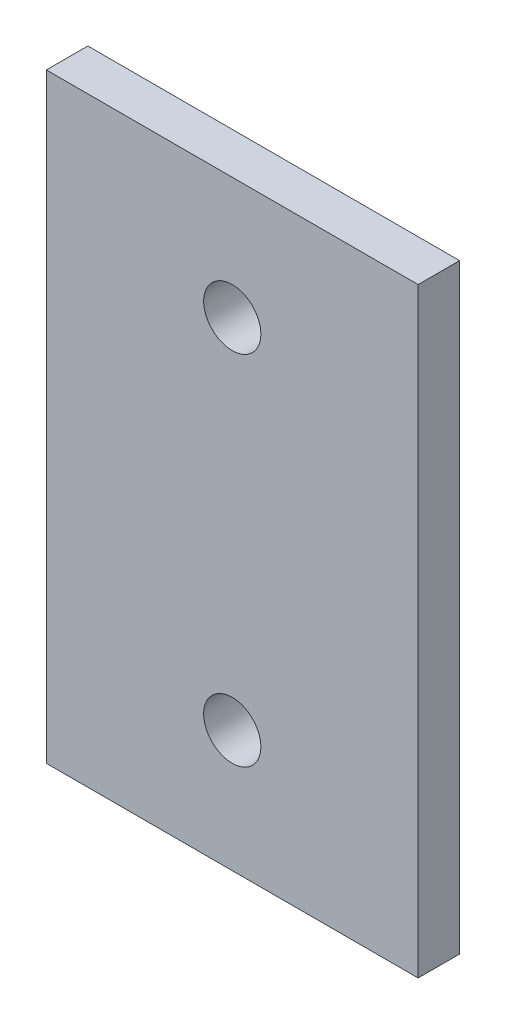
ISO-10303-21;
HEADER;
FILE_DESCRIPTION(('STEP AP214'),'2;1');
FILE_NAME('part.step','',(''),(''),'','','');
FILE_SCHEMA(('AUTOMOTIVE_DESIGN { 1 0 10303 214 1 1 1 1 }'));
ENDSEC;
DATA;
#1=APPLICATION_CONTEXT('core data for automotive mechanical design processes');
#2=APPLICATION_PROTOCOL_DEFINITION('international standard','automotive_design',2000,#1);
#3=PRODUCT_CONTEXT('',#1,'mechanical');
#4=PRODUCT('Part','Part','',(#3));
#5=PRODUCT_RELATED_PRODUCT_CATEGORY('part','',(#4));
#6=PRODUCT_DEFINITION_FORMATION('','',#4);
#7=PRODUCT_DEFINITION_CONTEXT('part definition',#1,'design');
#8=PRODUCT_DEFINITION('design','',#6,#7);
#9=PRODUCT_DEFINITION_SHAPE('','',#8);
#10=(LENGTH_UNIT() NAMED_UNIT(*) SI_UNIT(.MILLI.,.METRE.));
#11=(NAMED_UNIT(*) PLANE_ANGLE_UNIT() SI_UNIT($,.RADIAN.));
#12=(NAMED_UNIT(*) SI_UNIT($,.STERADIAN.) SOLID_ANGLE_UNIT());
#13=UNCERTAINTY_MEASURE_WITH_UNIT(LENGTH_MEASURE(1.E-05),#10,'distance_accuracy_value','');
#14=(GEOMETRIC_REPRESENTATION_CONTEXT(3) GLOBAL_UNCERTAINTY_ASSIGNED_CONTEXT((#13)) GLOBAL_UNIT_ASSIGNED_CONTEXT((#10,
#11,#12)) REPRESENTATION_CONTEXT('',''));
#15=CARTESIAN_POINT('',(0.,0.,0.));
#16=DIRECTION('',(0.,0.,1.));
#17=DIRECTION('',(1.,0.,0.));
#18=AXIS2_PLACEMENT_3D('',#15,#16,#17);
#19=CARTESIAN_POINT('',(0.,0.,5.8));
#20=DIRECTION('',(0.,0.,-1.));
#21=DIRECTION('',(-1.,0.,0.));
#22=AXIS2_PLACEMENT_3D('',#19,#20,#21);
#23=PLANE('',#22);
#24=DIRECTION('',(0.,-1.,0.));
#25=VECTOR('',#24,1.);
#26=CARTESIAN_POINT('',(0.,0.,5.8));
#27=LINE('',#26,#25);
#28=CARTESIAN_POINT('',(0.,84.,5.8));
#29=VERTEX_POINT('',#28);
#30=CARTESIAN_POINT('',(0.,0.,5.8));
#31=VERTEX_POINT('',#30);
#32=EDGE_CURVE('E87',#29,#31,#27,.T.);
#33=ORIENTED_EDGE('',*,*,#32,.T.);
#34=DIRECTION('',(1.,0.,0.));
#35=VECTOR('',#34,1.);
#36=CARTESIAN_POINT('',(0.,0.,5.8));
#37=LINE('',#36,#35);
#38=CARTESIAN_POINT('',(52.,0.,5.8));
#39=VERTEX_POINT('',#38);
#40=EDGE_CURVE('E82',#31,#39,#37,.T.);
#41=ORIENTED_EDGE('',*,*,#40,.T.);
#42=DIRECTION('',(0.,1.,0.));
#43=VECTOR('',#42,1.);
#44=CARTESIAN_POINT('',(52.,0.,5.8));
#45=LINE('',#44,#43);
#46=CARTESIAN_POINT('',(52.,84.,5.8));
#47=VERTEX_POINT('',#46);
#48=EDGE_CURVE('E85',#39,#47,#45,.T.);
#49=ORIENTED_EDGE('',*,*,#48,.T.);
#50=DIRECTION('',(-1.,0.,0.));
#51=VECTOR('',#50,1.);
#52=CARTESIAN_POINT('',(0.,84.,5.8));
#53=LINE('',#52,#51);
#54=EDGE_CURVE('E52',#47,#29,#53,.T.);
#55=ORIENTED_EDGE('',*,*,#54,.T.);
#56=EDGE_LOOP('',(#33,#41,#49,#55));
#57=FACE_BOUND('',#56,.T.);
#58=CARTESIAN_POINT('',(26.,67.,5.8));
#59=DIRECTION('',(0.,0.,1.));
#60=DIRECTION('',(1.,0.,0.));
#61=AXIS2_PLACEMENT_3D('',#58,#59,#60);
#62=CIRCLE('',#61,4.);
#63=CARTESIAN_POINT('',(30.,67.,5.8));
#64=VERTEX_POINT('',#63);
#65=EDGE_CURVE('E102',#64,#64,#62,.T.);
#66=ORIENTED_EDGE('',*,*,#65,.F.);
#67=EDGE_LOOP('',(#66));
#68=FACE_BOUND('',#67,.T.);
#69=CARTESIAN_POINT('',(26.,17.,5.8));
#70=DIRECTION('',(0.,0.,1.));
#71=DIRECTION('',(1.,0.,0.));
#72=AXIS2_PLACEMENT_3D('',#69,#70,#71);
#73=CIRCLE('',#72,4.);
#74=CARTESIAN_POINT('',(30.,17.,5.8));
#75=VERTEX_POINT('',#74);
#76=EDGE_CURVE('E117',#75,#75,#73,.T.);
#77=ORIENTED_EDGE('',*,*,#76,.F.);
#78=EDGE_LOOP('',(#77));
#79=FACE_BOUND('',#78,.T.);
#80=ADVANCED_FACE('F35',(#57,#68,#79),#23,.F.);
#81=CARTESIAN_POINT('',(0.,0.,0.));
#82=DIRECTION('',(0.,0.,-1.));
#83=DIRECTION('',(-1.,0.,0.));
#84=AXIS2_PLACEMENT_3D('',#81,#82,#83);
#85=PLANE('',#84);
#86=CARTESIAN_POINT('',(26.,67.,0.));
#87=DIRECTION('',(0.,0.,1.));
#88=DIRECTION('',(1.,0.,0.));
#89=AXIS2_PLACEMENT_3D('',#86,#87,#88);
#90=CIRCLE('',#89,4.);
#91=CARTESIAN_POINT('',(30.,67.,0.));
#92=VERTEX_POINT('',#91);
#93=EDGE_CURVE('E114',#92,#92,#90,.T.);
#94=ORIENTED_EDGE('',*,*,#93,.T.);
#95=EDGE_LOOP('',(#94));
#96=FACE_BOUND('',#95,.T.);
#97=DIRECTION('',(0.,-1.,0.));
#98=VECTOR('',#97,1.);
#99=CARTESIAN_POINT('',(0.,0.,0.));
#100=LINE('',#99,#98);
#101=CARTESIAN_POINT('',(0.,84.,0.));
#102=VERTEX_POINT('',#101);
#103=CARTESIAN_POINT('',(0.,0.,0.));
#104=VERTEX_POINT('',#103);
#105=EDGE_CURVE('E99',#102,#104,#100,.T.);
#106=ORIENTED_EDGE('',*,*,#105,.F.);
#107=DIRECTION('',(-1.,0.,0.));
#108=VECTOR('',#107,1.);
#109=CARTESIAN_POINT('',(0.,84.,0.));
#110=LINE('',#109,#108);
#111=CARTESIAN_POINT('',(52.,84.,0.));
#112=VERTEX_POINT('',#111);
#113=EDGE_CURVE('E75',#112,#102,#110,.T.);
#114=ORIENTED_EDGE('',*,*,#113,.F.);
#115=DIRECTION('',(0.,1.,0.));
#116=VECTOR('',#115,1.);
#117=CARTESIAN_POINT('',(52.,0.,0.));
#118=LINE('',#117,#116);
#119=CARTESIAN_POINT('',(52.,0.,0.));
#120=VERTEX_POINT('',#119);
#121=EDGE_CURVE('E69',#120,#112,#118,.T.);
#122=ORIENTED_EDGE('',*,*,#121,.F.);
#123=DIRECTION('',(1.,0.,0.));
#124=VECTOR('',#123,1.);
#125=CARTESIAN_POINT('',(0.,0.,0.));
#126=LINE('',#125,#124);
#127=EDGE_CURVE('E91',#104,#120,#126,.T.);
#128=ORIENTED_EDGE('',*,*,#127,.F.);
#129=EDGE_LOOP('',(#106,#114,#122,#128));
#130=FACE_BOUND('',#129,.T.);
#131=CARTESIAN_POINT('',(26.,17.,0.));
#132=DIRECTION('',(0.,0.,1.));
#133=DIRECTION('',(1.,0.,0.));
#134=AXIS2_PLACEMENT_3D('',#131,#132,#133);
#135=CIRCLE('',#134,4.);
#136=CARTESIAN_POINT('',(30.,17.,0.));
#137=VERTEX_POINT('',#136);
#138=EDGE_CURVE('E120',#137,#137,#135,.T.);
#139=ORIENTED_EDGE('',*,*,#138,.T.);
#140=EDGE_LOOP('',(#139));
#141=FACE_BOUND('',#140,.T.);
#142=ADVANCED_FACE('F110',(#96,#130,#141),#85,.T.);
#143=CARTESIAN_POINT('',(0.,0.,5.8));
#144=DIRECTION('',(1.,0.,0.));
#145=DIRECTION('',(0.,0.,-1.));
#146=AXIS2_PLACEMENT_3D('',#143,#144,#145);
#147=PLANE('',#146);
#148=ORIENTED_EDGE('',*,*,#105,.T.);
#149=DIRECTION('',(0.,0.,-1.));
#150=VECTOR('',#149,1.);
#151=CARTESIAN_POINT('',(0.,0.,5.8));
#152=LINE('',#151,#150);
#153=EDGE_CURVE('E11',#31,#104,#152,.T.);
#154=ORIENTED_EDGE('',*,*,#153,.F.);
#155=ORIENTED_EDGE('',*,*,#32,.F.);
#156=DIRECTION('',(0.,0.,-1.));
#157=VECTOR('',#156,1.);
#158=CARTESIAN_POINT('',(0.,84.,5.8));
#159=LINE('',#158,#157);
#160=EDGE_CURVE('E95',#29,#102,#159,.T.);
#161=ORIENTED_EDGE('',*,*,#160,.T.);
#162=EDGE_LOOP('',(#148,#154,#155,#161));
#163=FACE_BOUND('',#162,.T.);
#164=ADVANCED_FACE('F37',(#163),#147,.F.);
#165=CARTESIAN_POINT('',(0.,0.,5.8));
#166=DIRECTION('',(0.,1.,0.));
#167=DIRECTION('',(0.,0.,1.));
#168=AXIS2_PLACEMENT_3D('',#165,#166,#167);
#169=PLANE('',#168);
#170=ORIENTED_EDGE('',*,*,#127,.T.);
#171=DIRECTION('',(0.,0.,-1.));
#172=VECTOR('',#171,1.);
#173=CARTESIAN_POINT('',(52.,0.,5.8));
#174=LINE('',#173,#172);
#175=EDGE_CURVE('E44',#39,#120,#174,.T.);
#176=ORIENTED_EDGE('',*,*,#175,.F.);
#177=ORIENTED_EDGE('',*,*,#40,.F.);
#178=ORIENTED_EDGE('',*,*,#153,.T.);
#179=EDGE_LOOP('',(#170,#176,#177,#178));
#180=FACE_BOUND('',#179,.T.);
#181=ADVANCED_FACE('F90',(#180),#169,.F.);
#182=CARTESIAN_POINT('',(52.,0.,5.8));
#183=DIRECTION('',(-1.,0.,0.));
#184=DIRECTION('',(0.,0.,1.));
#185=AXIS2_PLACEMENT_3D('',#182,#183,#184);
#186=PLANE('',#185);
#187=ORIENTED_EDGE('',*,*,#121,.T.);
#188=DIRECTION('',(0.,0.,-1.));
#189=VECTOR('',#188,1.);
#190=CARTESIAN_POINT('',(52.,84.,5.8));
#191=LINE('',#190,#189);
#192=EDGE_CURVE('E92',#47,#112,#191,.T.);
#193=ORIENTED_EDGE('',*,*,#192,.F.);
#194=ORIENTED_EDGE('',*,*,#48,.F.);
#195=ORIENTED_EDGE('',*,*,#175,.T.);
#196=EDGE_LOOP('',(#187,#193,#194,#195));
#197=FACE_BOUND('',#196,.T.);
#198=ADVANCED_FACE('F93',(#197),#186,.F.);
#199=CARTESIAN_POINT('',(0.,84.,5.8));
#200=DIRECTION('',(0.,-1.,0.));
#201=DIRECTION('',(0.,0.,-1.));
#202=AXIS2_PLACEMENT_3D('',#199,#200,#201);
#203=PLANE('',#202);
#204=ORIENTED_EDGE('',*,*,#113,.T.);
#205=ORIENTED_EDGE('',*,*,#160,.F.);
#206=ORIENTED_EDGE('',*,*,#54,.F.);
#207=ORIENTED_EDGE('',*,*,#192,.T.);
#208=EDGE_LOOP('',(#204,#205,#206,#207));
#209=FACE_BOUND('',#208,.T.);
#210=ADVANCED_FACE('F107',(#209),#203,.F.);
#211=CARTESIAN_POINT('',(26.,67.,5.8));
#212=DIRECTION('',(0.,0.,-1.));
#213=DIRECTION('',(-1.,0.,0.));
#214=AXIS2_PLACEMENT_3D('',#211,#212,#213);
#215=CYLINDRICAL_SURFACE('',#214,4.);
#216=ORIENTED_EDGE('',*,*,#65,.T.);
#217=EDGE_LOOP('',(#216));
#218=FACE_BOUND('',#217,.T.);
#219=ORIENTED_EDGE('',*,*,#93,.F.);
#220=EDGE_LOOP('',(#219));
#221=FACE_BOUND('',#220,.T.);
#222=ADVANCED_FACE('F137',(#218,#221),#215,.F.);
#223=CARTESIAN_POINT('',(26.,17.,5.8));
#224=DIRECTION('',(0.,0.,-1.));
#225=DIRECTION('',(-1.,0.,0.));
#226=AXIS2_PLACEMENT_3D('',#223,#224,#225);
#227=CYLINDRICAL_SURFACE('',#226,4.);
#228=ORIENTED_EDGE('',*,*,#76,.T.);
#229=EDGE_LOOP('',(#228));
#230=FACE_BOUND('',#229,.T.);
#231=ORIENTED_EDGE('',*,*,#138,.F.);
#232=EDGE_LOOP('',(#231));
#233=FACE_BOUND('',#232,.T.);
#234=ADVANCED_FACE('F126',(#230,#233),#227,.F.);
#235=CLOSED_SHELL('',(#80,#142,#164,#181,#198,#210,#222,#234));
#236=MANIFOLD_SOLID_BREP('B2',#235);
#237=ADVANCED_BREP_SHAPE_REPRESENTATION('',(#18,#236),#14);
#238=SHAPE_DEFINITION_REPRESENTATION(#9,#237);
ENDSEC;
END-ISO-10303-21;
